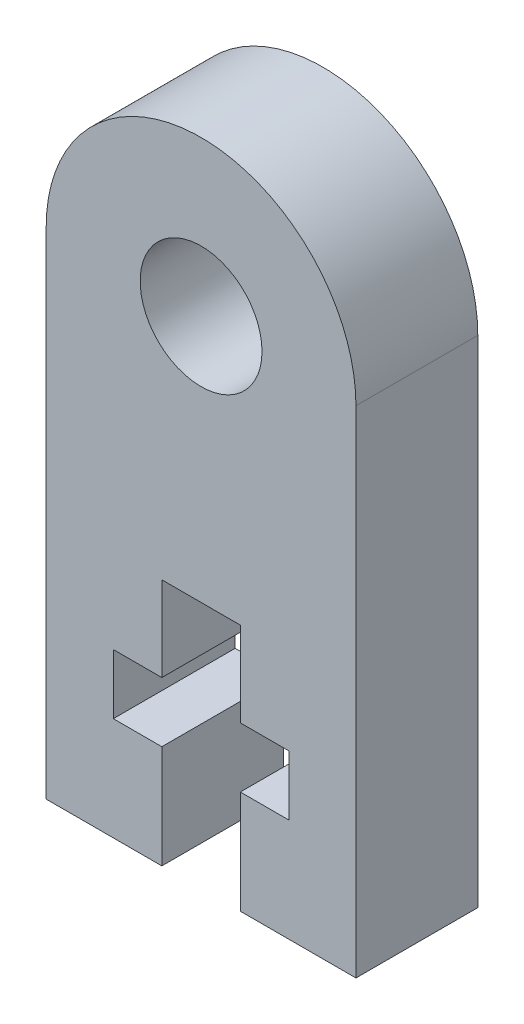
ISO-10303-21;
HEADER;
FILE_DESCRIPTION(('STEP AP214'),'2;1');
FILE_NAME('part.step','',(''),(''),'','','');
FILE_SCHEMA(('AUTOMOTIVE_DESIGN { 1 0 10303 214 1 1 1 1 }'));
ENDSEC;
DATA;
#1=APPLICATION_CONTEXT('core data for automotive mechanical design processes');
#2=APPLICATION_PROTOCOL_DEFINITION('international standard','automotive_design',2000,#1);
#3=PRODUCT_CONTEXT('',#1,'mechanical');
#4=PRODUCT('Part','Part','',(#3));
#5=PRODUCT_RELATED_PRODUCT_CATEGORY('part','',(#4));
#6=PRODUCT_DEFINITION_FORMATION('','',#4);
#7=PRODUCT_DEFINITION_CONTEXT('part definition',#1,'design');
#8=PRODUCT_DEFINITION('design','',#6,#7);
#9=PRODUCT_DEFINITION_SHAPE('','',#8);
#10=(LENGTH_UNIT() NAMED_UNIT(*) SI_UNIT(.MILLI.,.METRE.));
#11=(NAMED_UNIT(*) PLANE_ANGLE_UNIT() SI_UNIT($,.RADIAN.));
#12=(NAMED_UNIT(*) SI_UNIT($,.STERADIAN.) SOLID_ANGLE_UNIT());
#13=UNCERTAINTY_MEASURE_WITH_UNIT(LENGTH_MEASURE(1.E-05),#10,'distance_accuracy_value','');
#14=(GEOMETRIC_REPRESENTATION_CONTEXT(3) GLOBAL_UNCERTAINTY_ASSIGNED_CONTEXT((#13)) GLOBAL_UNIT_ASSIGNED_CONTEXT((#10,
#11,#12)) REPRESENTATION_CONTEXT('',''));
#15=CARTESIAN_POINT('',(0.,0.,0.));
#16=DIRECTION('',(0.,0.,1.));
#17=DIRECTION('',(1.,0.,0.));
#18=AXIS2_PLACEMENT_3D('',#15,#16,#17);
#19=CARTESIAN_POINT('',(-7.5,-24.,5.9));
#20=DIRECTION('',(0.,1.,0.));
#21=DIRECTION('',(-1.,0.,0.));
#22=AXIS2_PLACEMENT_3D('',#19,#20,#21);
#23=PLANE('',#22);
#24=DIRECTION('',(1.,0.,0.));
#25=VECTOR('',#24,1.);
#26=CARTESIAN_POINT('',(-7.5,-24.,0.));
#27=LINE('',#26,#25);
#28=CARTESIAN_POINT('',(-7.5,-24.,0.));
#29=VERTEX_POINT('',#28);
#30=CARTESIAN_POINT('',(-1.9,-24.,0.));
#31=VERTEX_POINT('',#30);
#32=EDGE_CURVE('E185',#29,#31,#27,.T.);
#33=ORIENTED_EDGE('',*,*,#32,.T.);
#34=DIRECTION('',(0.,0.,1.));
#35=VECTOR('',#34,1.);
#36=CARTESIAN_POINT('',(-1.9,-24.,0.));
#37=LINE('',#36,#35);
#38=CARTESIAN_POINT('',(-1.9,-24.,5.9));
#39=VERTEX_POINT('',#38);
#40=EDGE_CURVE('E168',#31,#39,#37,.T.);
#41=ORIENTED_EDGE('',*,*,#40,.T.);
#42=DIRECTION('',(1.,0.,0.));
#43=VECTOR('',#42,1.);
#44=CARTESIAN_POINT('',(-7.5,-24.,5.9));
#45=LINE('',#44,#43);
#46=CARTESIAN_POINT('',(-7.5,-24.,5.9));
#47=VERTEX_POINT('',#46);
#48=EDGE_CURVE('E232',#47,#39,#45,.T.);
#49=ORIENTED_EDGE('',*,*,#48,.F.);
#50=DIRECTION('',(0.,0.,-1.));
#51=VECTOR('',#50,1.);
#52=CARTESIAN_POINT('',(-7.5,-24.,5.9));
#53=LINE('',#52,#51);
#54=EDGE_CURVE('E190',#47,#29,#53,.T.);
#55=ORIENTED_EDGE('',*,*,#54,.T.);
#56=EDGE_LOOP('',(#33,#41,#49,#55));
#57=FACE_BOUND('',#56,.T.);
#58=ADVANCED_FACE('F45',(#57),#23,.F.);
#59=CARTESIAN_POINT('',(0.,0.,5.9));
#60=DIRECTION('',(0.,0.,-1.));
#61=DIRECTION('',(-1.,0.,0.));
#62=AXIS2_PLACEMENT_3D('',#59,#60,#61);
#63=PLANE('',#62);
#64=ORIENTED_EDGE('',*,*,#48,.T.);
#65=DIRECTION('',(0.,-1.,0.));
#66=VECTOR('',#65,1.);
#67=CARTESIAN_POINT('',(-1.9,-24.,5.9));
#68=LINE('',#67,#66);
#69=CARTESIAN_POINT('',(-1.9,-19.,5.9));
#70=VERTEX_POINT('',#69);
#71=EDGE_CURVE('E174',#70,#39,#68,.T.);
#72=ORIENTED_EDGE('',*,*,#71,.F.);
#73=DIRECTION('',(1.,0.,0.));
#74=VECTOR('',#73,1.);
#75=CARTESIAN_POINT('',(-4.25,-19.,5.9));
#76=LINE('',#75,#74);
#77=CARTESIAN_POINT('',(-4.25,-19.,5.9));
#78=VERTEX_POINT('',#77);
#79=EDGE_CURVE('E188',#78,#70,#76,.T.);
#80=ORIENTED_EDGE('',*,*,#79,.F.);
#81=DIRECTION('',(0.,-1.,0.));
#82=VECTOR('',#81,1.);
#83=CARTESIAN_POINT('',(-4.25,-16.1,5.9));
#84=LINE('',#83,#82);
#85=CARTESIAN_POINT('',(-4.25,-16.1,5.9));
#86=VERTEX_POINT('',#85);
#87=EDGE_CURVE('E267',#86,#78,#84,.T.);
#88=ORIENTED_EDGE('',*,*,#87,.F.);
#89=DIRECTION('',(-1.,0.,0.));
#90=VECTOR('',#89,1.);
#91=CARTESIAN_POINT('',(-4.25,-16.1,5.9));
#92=LINE('',#91,#90);
#93=CARTESIAN_POINT('',(-1.9,-16.1,5.9));
#94=VERTEX_POINT('',#93);
#95=EDGE_CURVE('E264',#94,#86,#92,.T.);
#96=ORIENTED_EDGE('',*,*,#95,.F.);
#97=DIRECTION('',(0.,-1.,0.));
#98=VECTOR('',#97,1.);
#99=CARTESIAN_POINT('',(-1.9,-16.1,5.9));
#100=LINE('',#99,#98);
#101=CARTESIAN_POINT('',(-1.9,-12.,5.9));
#102=VERTEX_POINT('',#101);
#103=EDGE_CURVE('E261',#102,#94,#100,.T.);
#104=ORIENTED_EDGE('',*,*,#103,.F.);
#105=DIRECTION('',(-1.,0.,0.));
#106=VECTOR('',#105,1.);
#107=CARTESIAN_POINT('',(-1.9,-12.,5.9));
#108=LINE('',#107,#106);
#109=CARTESIAN_POINT('',(1.9,-12.,5.9));
#110=VERTEX_POINT('',#109);
#111=EDGE_CURVE('E258',#110,#102,#108,.T.);
#112=ORIENTED_EDGE('',*,*,#111,.F.);
#113=DIRECTION('',(0.,1.,0.));
#114=VECTOR('',#113,1.);
#115=CARTESIAN_POINT('',(1.9,-16.1,5.9));
#116=LINE('',#115,#114);
#117=CARTESIAN_POINT('',(1.9,-16.1,5.9));
#118=VERTEX_POINT('',#117);
#119=EDGE_CURVE('E255',#118,#110,#116,.T.);
#120=ORIENTED_EDGE('',*,*,#119,.F.);
#121=DIRECTION('',(-1.,0.,0.));
#122=VECTOR('',#121,1.);
#123=CARTESIAN_POINT('',(1.9,-16.1,5.9));
#124=LINE('',#123,#122);
#125=CARTESIAN_POINT('',(4.25,-16.1,5.9));
#126=VERTEX_POINT('',#125);
#127=EDGE_CURVE('E252',#126,#118,#124,.T.);
#128=ORIENTED_EDGE('',*,*,#127,.F.);
#129=DIRECTION('',(0.,1.,0.));
#130=VECTOR('',#129,1.);
#131=CARTESIAN_POINT('',(4.25,-16.1,5.9));
#132=LINE('',#131,#130);
#133=CARTESIAN_POINT('',(4.25,-19.,5.9));
#134=VERTEX_POINT('',#133);
#135=EDGE_CURVE('E249',#134,#126,#132,.T.);
#136=ORIENTED_EDGE('',*,*,#135,.F.);
#137=DIRECTION('',(1.,0.,0.));
#138=VECTOR('',#137,1.);
#139=CARTESIAN_POINT('',(1.9,-19.,5.9));
#140=LINE('',#139,#138);
#141=CARTESIAN_POINT('',(1.9,-19.,5.9));
#142=VERTEX_POINT('',#141);
#143=EDGE_CURVE('E242',#142,#134,#140,.T.);
#144=ORIENTED_EDGE('',*,*,#143,.F.);
#145=DIRECTION('',(0.,1.,0.));
#146=VECTOR('',#145,1.);
#147=CARTESIAN_POINT('',(1.9,-24.,5.9));
#148=LINE('',#147,#146);
#149=CARTESIAN_POINT('',(1.9,-24.,5.9));
#150=VERTEX_POINT('',#149);
#151=EDGE_CURVE('E240',#150,#142,#148,.T.);
#152=ORIENTED_EDGE('',*,*,#151,.F.);
#153=CARTESIAN_POINT('',(7.5,-24.,5.9));
#154=VERTEX_POINT('',#153);
#155=EDGE_CURVE('E97',#150,#154,#45,.T.);
#156=ORIENTED_EDGE('',*,*,#155,.T.);
#157=DIRECTION('',(0.,1.,0.));
#158=VECTOR('',#157,1.);
#159=CARTESIAN_POINT('',(7.5,-24.,5.9));
#160=LINE('',#159,#158);
#161=CARTESIAN_POINT('',(7.5,0.,5.9));
#162=VERTEX_POINT('',#161);
#163=EDGE_CURVE('E217',#154,#162,#160,.T.);
#164=ORIENTED_EDGE('',*,*,#163,.T.);
#165=CARTESIAN_POINT('',(0.,0.,5.9));
#166=DIRECTION('',(0.,0.,1.));
#167=DIRECTION('',(-1.,0.,0.));
#168=AXIS2_PLACEMENT_3D('',#165,#166,#167);
#169=CIRCLE('',#168,7.5);
#170=CARTESIAN_POINT('',(-7.5,0.,5.9));
#171=VERTEX_POINT('',#170);
#172=EDGE_CURVE('E211',#162,#171,#169,.T.);
#173=ORIENTED_EDGE('',*,*,#172,.T.);
#174=DIRECTION('',(0.,-1.,0.));
#175=VECTOR('',#174,1.);
#176=CARTESIAN_POINT('',(-7.5,0.,5.9));
#177=LINE('',#176,#175);
#178=EDGE_CURVE('E69',#171,#47,#177,.T.);
#179=ORIENTED_EDGE('',*,*,#178,.T.);
#180=EDGE_LOOP('',(#64,#72,#80,#88,#96,#104,#112,#120,#128,#136,#144,#152,#156,#164,#173,#179));
#181=FACE_BOUND('',#180,.T.);
#182=CARTESIAN_POINT('',(0.,0.,5.9));
#183=DIRECTION('',(0.,0.,1.));
#184=DIRECTION('',(1.,0.,0.));
#185=AXIS2_PLACEMENT_3D('',#182,#183,#184);
#186=CIRCLE('',#185,2.95);
#187=CARTESIAN_POINT('',(2.95,0.,5.9));
#188=VERTEX_POINT('',#187);
#189=EDGE_CURVE('E196',#188,#188,#186,.T.);
#190=ORIENTED_EDGE('',*,*,#189,.F.);
#191=EDGE_LOOP('',(#190));
#192=FACE_BOUND('',#191,.T.);
#193=ADVANCED_FACE('F234',(#181,#192),#63,.F.);
#194=CARTESIAN_POINT('',(0.,0.,0.));
#195=DIRECTION('',(0.,0.,-1.));
#196=DIRECTION('',(-1.,0.,0.));
#197=AXIS2_PLACEMENT_3D('',#194,#195,#196);
#198=PLANE('',#197);
#199=DIRECTION('',(0.,-1.,0.));
#200=VECTOR('',#199,1.);
#201=CARTESIAN_POINT('',(-1.9,-24.,0.));
#202=LINE('',#201,#200);
#203=CARTESIAN_POINT('',(-1.9,-19.,0.));
#204=VERTEX_POINT('',#203);
#205=EDGE_CURVE('E171',#204,#31,#202,.T.);
#206=ORIENTED_EDGE('',*,*,#205,.T.);
#207=ORIENTED_EDGE('',*,*,#32,.F.);
#208=DIRECTION('',(0.,-1.,0.));
#209=VECTOR('',#208,1.);
#210=CARTESIAN_POINT('',(-7.5,0.,0.));
#211=LINE('',#210,#209);
#212=CARTESIAN_POINT('',(-7.5,0.,0.));
#213=VERTEX_POINT('',#212);
#214=EDGE_CURVE('E90',#213,#29,#211,.T.);
#215=ORIENTED_EDGE('',*,*,#214,.F.);
#216=CARTESIAN_POINT('',(0.,0.,0.));
#217=DIRECTION('',(0.,0.,1.));
#218=DIRECTION('',(-1.,0.,0.));
#219=AXIS2_PLACEMENT_3D('',#216,#217,#218);
#220=CIRCLE('',#219,7.5);
#221=CARTESIAN_POINT('',(7.5,0.,0.));
#222=VERTEX_POINT('',#221);
#223=EDGE_CURVE('E194',#222,#213,#220,.T.);
#224=ORIENTED_EDGE('',*,*,#223,.F.);
#225=DIRECTION('',(0.,1.,0.));
#226=VECTOR('',#225,1.);
#227=CARTESIAN_POINT('',(7.5,-24.,0.));
#228=LINE('',#227,#226);
#229=CARTESIAN_POINT('',(7.5,-24.,0.));
#230=VERTEX_POINT('',#229);
#231=EDGE_CURVE('E191',#230,#222,#228,.T.);
#232=ORIENTED_EDGE('',*,*,#231,.F.);
#233=CARTESIAN_POINT('',(1.9,-24.,0.));
#234=VERTEX_POINT('',#233);
#235=EDGE_CURVE('E192',#234,#230,#27,.T.);
#236=ORIENTED_EDGE('',*,*,#235,.F.);
#237=DIRECTION('',(0.,1.,0.));
#238=VECTOR('',#237,1.);
#239=CARTESIAN_POINT('',(1.9,-24.,0.));
#240=LINE('',#239,#238);
#241=CARTESIAN_POINT('',(1.9,-19.,0.));
#242=VERTEX_POINT('',#241);
#243=EDGE_CURVE('E60',#234,#242,#240,.T.);
#244=ORIENTED_EDGE('',*,*,#243,.T.);
#245=DIRECTION('',(1.,0.,0.));
#246=VECTOR('',#245,1.);
#247=CARTESIAN_POINT('',(1.9,-19.,0.));
#248=LINE('',#247,#246);
#249=CARTESIAN_POINT('',(4.25,-19.,0.));
#250=VERTEX_POINT('',#249);
#251=EDGE_CURVE('E308',#242,#250,#248,.T.);
#252=ORIENTED_EDGE('',*,*,#251,.T.);
#253=DIRECTION('',(0.,1.,0.));
#254=VECTOR('',#253,1.);
#255=CARTESIAN_POINT('',(4.25,-16.1,0.));
#256=LINE('',#255,#254);
#257=CARTESIAN_POINT('',(4.25,-16.1,0.));
#258=VERTEX_POINT('',#257);
#259=EDGE_CURVE('E291',#250,#258,#256,.T.);
#260=ORIENTED_EDGE('',*,*,#259,.T.);
#261=DIRECTION('',(-1.,0.,0.));
#262=VECTOR('',#261,1.);
#263=CARTESIAN_POINT('',(1.9,-16.1,0.));
#264=LINE('',#263,#262);
#265=CARTESIAN_POINT('',(1.9,-16.1,0.));
#266=VERTEX_POINT('',#265);
#267=EDGE_CURVE('E304',#258,#266,#264,.T.);
#268=ORIENTED_EDGE('',*,*,#267,.T.);
#269=DIRECTION('',(0.,1.,0.));
#270=VECTOR('',#269,1.);
#271=CARTESIAN_POINT('',(1.9,-16.1,0.));
#272=LINE('',#271,#270);
#273=CARTESIAN_POINT('',(1.9,-12.,0.));
#274=VERTEX_POINT('',#273);
#275=EDGE_CURVE('E306',#266,#274,#272,.T.);
#276=ORIENTED_EDGE('',*,*,#275,.T.);
#277=DIRECTION('',(-1.,0.,0.));
#278=VECTOR('',#277,1.);
#279=CARTESIAN_POINT('',(-1.9,-12.,0.));
#280=LINE('',#279,#278);
#281=CARTESIAN_POINT('',(-1.9,-12.,0.));
#282=VERTEX_POINT('',#281);
#283=EDGE_CURVE('E314',#274,#282,#280,.T.);
#284=ORIENTED_EDGE('',*,*,#283,.T.);
#285=DIRECTION('',(0.,-1.,0.));
#286=VECTOR('',#285,1.);
#287=CARTESIAN_POINT('',(-1.9,-16.1,0.));
#288=LINE('',#287,#286);
#289=CARTESIAN_POINT('',(-1.9,-16.1,0.));
#290=VERTEX_POINT('',#289);
#291=EDGE_CURVE('E317',#282,#290,#288,.T.);
#292=ORIENTED_EDGE('',*,*,#291,.T.);
#293=DIRECTION('',(-1.,0.,0.));
#294=VECTOR('',#293,1.);
#295=CARTESIAN_POINT('',(-4.25,-16.1,0.));
#296=LINE('',#295,#294);
#297=CARTESIAN_POINT('',(-4.25,-16.1,0.));
#298=VERTEX_POINT('',#297);
#299=EDGE_CURVE('E320',#290,#298,#296,.T.);
#300=ORIENTED_EDGE('',*,*,#299,.T.);
#301=DIRECTION('',(0.,-1.,0.));
#302=VECTOR('',#301,1.);
#303=CARTESIAN_POINT('',(-4.25,-16.1,0.));
#304=LINE('',#303,#302);
#305=CARTESIAN_POINT('',(-4.25,-19.,0.));
#306=VERTEX_POINT('',#305);
#307=EDGE_CURVE('E322',#298,#306,#304,.T.);
#308=ORIENTED_EDGE('',*,*,#307,.T.);
#309=DIRECTION('',(1.,0.,0.));
#310=VECTOR('',#309,1.);
#311=CARTESIAN_POINT('',(-4.25,-19.,0.));
#312=LINE('',#311,#310);
#313=EDGE_CURVE('E179',#306,#204,#312,.T.);
#314=ORIENTED_EDGE('',*,*,#313,.T.);
#315=EDGE_LOOP('',(#206,#207,#215,#224,#232,#236,#244,#252,#260,#268,#276,#284,#292,#300,#308,#314));
#316=FACE_BOUND('',#315,.T.);
#317=CARTESIAN_POINT('',(0.,0.,0.));
#318=DIRECTION('',(0.,0.,1.));
#319=DIRECTION('',(1.,0.,0.));
#320=AXIS2_PLACEMENT_3D('',#317,#318,#319);
#321=CIRCLE('',#320,2.95);
#322=CARTESIAN_POINT('',(2.95,0.,0.));
#323=VERTEX_POINT('',#322);
#324=EDGE_CURVE('E228',#323,#323,#321,.T.);
#325=ORIENTED_EDGE('',*,*,#324,.T.);
#326=EDGE_LOOP('',(#325));
#327=FACE_BOUND('',#326,.T.);
#328=ADVANCED_FACE('F183',(#316,#327),#198,.T.);
#329=ORIENTED_EDGE('',*,*,#155,.F.);
#330=DIRECTION('',(0.,0.,1.));
#331=VECTOR('',#330,1.);
#332=CARTESIAN_POINT('',(1.9,-24.,0.));
#333=LINE('',#332,#331);
#334=EDGE_CURVE('E178',#234,#150,#333,.T.);
#335=ORIENTED_EDGE('',*,*,#334,.F.);
#336=ORIENTED_EDGE('',*,*,#235,.T.);
#337=DIRECTION('',(0.,0.,-1.));
#338=VECTOR('',#337,1.);
#339=CARTESIAN_POINT('',(7.5,-24.,5.9));
#340=LINE('',#339,#338);
#341=EDGE_CURVE('E13',#154,#230,#340,.T.);
#342=ORIENTED_EDGE('',*,*,#341,.F.);
#343=EDGE_LOOP('',(#329,#335,#336,#342));
#344=FACE_BOUND('',#343,.T.);
#345=ADVANCED_FACE('F47',(#344),#23,.F.);
#346=CARTESIAN_POINT('',(7.5,-24.,5.9));
#347=DIRECTION('',(-1.,0.,0.));
#348=DIRECTION('',(0.,-1.,0.));
#349=AXIS2_PLACEMENT_3D('',#346,#347,#348);
#350=PLANE('',#349);
#351=ORIENTED_EDGE('',*,*,#231,.T.);
#352=DIRECTION('',(0.,0.,-1.));
#353=VECTOR('',#352,1.);
#354=CARTESIAN_POINT('',(7.5,0.,5.9));
#355=LINE('',#354,#353);
#356=EDGE_CURVE('E53',#162,#222,#355,.T.);
#357=ORIENTED_EDGE('',*,*,#356,.F.);
#358=ORIENTED_EDGE('',*,*,#163,.F.);
#359=ORIENTED_EDGE('',*,*,#341,.T.);
#360=EDGE_LOOP('',(#351,#357,#358,#359));
#361=FACE_BOUND('',#360,.T.);
#362=ADVANCED_FACE('F216',(#361),#350,.F.);
#363=CARTESIAN_POINT('',(0.,0.,5.9));
#364=DIRECTION('',(0.,0.,-1.));
#365=DIRECTION('',(-1.,0.,0.));
#366=AXIS2_PLACEMENT_3D('',#363,#364,#365);
#367=CYLINDRICAL_SURFACE('',#366,7.5);
#368=ORIENTED_EDGE('',*,*,#223,.T.);
#369=DIRECTION('',(0.,0.,-1.));
#370=VECTOR('',#369,1.);
#371=CARTESIAN_POINT('',(-7.5,0.,5.9));
#372=LINE('',#371,#370);
#373=EDGE_CURVE('E203',#171,#213,#372,.T.);
#374=ORIENTED_EDGE('',*,*,#373,.F.);
#375=ORIENTED_EDGE('',*,*,#172,.F.);
#376=ORIENTED_EDGE('',*,*,#356,.T.);
#377=EDGE_LOOP('',(#368,#374,#375,#376));
#378=FACE_BOUND('',#377,.T.);
#379=ADVANCED_FACE('F209',(#378),#367,.T.);
#380=CARTESIAN_POINT('',(-7.5,0.,5.9));
#381=DIRECTION('',(1.,0.,0.));
#382=DIRECTION('',(0.,1.,0.));
#383=AXIS2_PLACEMENT_3D('',#380,#381,#382);
#384=PLANE('',#383);
#385=ORIENTED_EDGE('',*,*,#214,.T.);
#386=ORIENTED_EDGE('',*,*,#54,.F.);
#387=ORIENTED_EDGE('',*,*,#178,.F.);
#388=ORIENTED_EDGE('',*,*,#373,.T.);
#389=EDGE_LOOP('',(#385,#386,#387,#388));
#390=FACE_BOUND('',#389,.T.);
#391=ADVANCED_FACE('F236',(#390),#384,.F.);
#392=CARTESIAN_POINT('',(0.,0.,5.9));
#393=DIRECTION('',(0.,0.,-1.));
#394=DIRECTION('',(-1.,0.,0.));
#395=AXIS2_PLACEMENT_3D('',#392,#393,#394);
#396=CYLINDRICAL_SURFACE('',#395,2.95);
#397=ORIENTED_EDGE('',*,*,#189,.T.);
#398=EDGE_LOOP('',(#397));
#399=FACE_BOUND('',#398,.T.);
#400=ORIENTED_EDGE('',*,*,#324,.F.);
#401=EDGE_LOOP('',(#400));
#402=FACE_BOUND('',#401,.T.);
#403=ADVANCED_FACE('F337',(#399,#402),#396,.F.);
#404=CARTESIAN_POINT('',(-1.9,-24.,0.));
#405=DIRECTION('',(-1.,0.,0.));
#406=DIRECTION('',(0.,0.,1.));
#407=AXIS2_PLACEMENT_3D('',#404,#405,#406);
#408=PLANE('',#407);
#409=ORIENTED_EDGE('',*,*,#71,.T.);
#410=ORIENTED_EDGE('',*,*,#40,.F.);
#411=ORIENTED_EDGE('',*,*,#205,.F.);
#412=DIRECTION('',(0.,0.,1.));
#413=VECTOR('',#412,1.);
#414=CARTESIAN_POINT('',(-1.9,-19.,0.));
#415=LINE('',#414,#413);
#416=EDGE_CURVE('E231',#204,#70,#415,.T.);
#417=ORIENTED_EDGE('',*,*,#416,.T.);
#418=EDGE_LOOP('',(#409,#410,#411,#417));
#419=FACE_BOUND('',#418,.T.);
#420=ADVANCED_FACE('F170',(#419),#408,.F.);
#421=CARTESIAN_POINT('',(-4.25,-19.,0.));
#422=DIRECTION('',(0.,-1.,0.));
#423=DIRECTION('',(0.,0.,-1.));
#424=AXIS2_PLACEMENT_3D('',#421,#422,#423);
#425=PLANE('',#424);
#426=ORIENTED_EDGE('',*,*,#79,.T.);
#427=ORIENTED_EDGE('',*,*,#416,.F.);
#428=ORIENTED_EDGE('',*,*,#313,.F.);
#429=DIRECTION('',(0.,0.,1.));
#430=VECTOR('',#429,1.);
#431=CARTESIAN_POINT('',(-4.25,-19.,0.));
#432=LINE('',#431,#430);
#433=EDGE_CURVE('E272',#306,#78,#432,.T.);
#434=ORIENTED_EDGE('',*,*,#433,.T.);
#435=EDGE_LOOP('',(#426,#427,#428,#434));
#436=FACE_BOUND('',#435,.T.);
#437=ADVANCED_FACE('F328',(#436),#425,.F.);
#438=CARTESIAN_POINT('',(-4.25,-16.1,0.));
#439=DIRECTION('',(-1.,0.,0.));
#440=DIRECTION('',(0.,0.,1.));
#441=AXIS2_PLACEMENT_3D('',#438,#439,#440);
#442=PLANE('',#441);
#443=ORIENTED_EDGE('',*,*,#87,.T.);
#444=ORIENTED_EDGE('',*,*,#433,.F.);
#445=ORIENTED_EDGE('',*,*,#307,.F.);
#446=DIRECTION('',(0.,0.,1.));
#447=VECTOR('',#446,1.);
#448=CARTESIAN_POINT('',(-4.25,-16.1,0.));
#449=LINE('',#448,#447);
#450=EDGE_CURVE('E274',#298,#86,#449,.T.);
#451=ORIENTED_EDGE('',*,*,#450,.T.);
#452=EDGE_LOOP('',(#443,#444,#445,#451));
#453=FACE_BOUND('',#452,.T.);
#454=ADVANCED_FACE('F326',(#453),#442,.F.);
#455=CARTESIAN_POINT('',(-4.25,-16.1,0.));
#456=DIRECTION('',(0.,1.,0.));
#457=DIRECTION('',(0.,0.,1.));
#458=AXIS2_PLACEMENT_3D('',#455,#456,#457);
#459=PLANE('',#458);
#460=ORIENTED_EDGE('',*,*,#95,.T.);
#461=ORIENTED_EDGE('',*,*,#450,.F.);
#462=ORIENTED_EDGE('',*,*,#299,.F.);
#463=DIRECTION('',(0.,0.,1.));
#464=VECTOR('',#463,1.);
#465=CARTESIAN_POINT('',(-1.9,-16.1,0.));
#466=LINE('',#465,#464);
#467=EDGE_CURVE('E276',#290,#94,#466,.T.);
#468=ORIENTED_EDGE('',*,*,#467,.T.);
#469=EDGE_LOOP('',(#460,#461,#462,#468));
#470=FACE_BOUND('',#469,.T.);
#471=ADVANCED_FACE('F335',(#470),#459,.F.);
#472=CARTESIAN_POINT('',(-1.9,-16.1,0.));
#473=DIRECTION('',(-1.,0.,0.));
#474=DIRECTION('',(0.,-1.,0.));
#475=AXIS2_PLACEMENT_3D('',#472,#473,#474);
#476=PLANE('',#475);
#477=ORIENTED_EDGE('',*,*,#103,.T.);
#478=ORIENTED_EDGE('',*,*,#467,.F.);
#479=ORIENTED_EDGE('',*,*,#291,.F.);
#480=DIRECTION('',(0.,0.,1.));
#481=VECTOR('',#480,1.);
#482=CARTESIAN_POINT('',(-1.9,-12.,0.));
#483=LINE('',#482,#481);
#484=EDGE_CURVE('E278',#282,#102,#483,.T.);
#485=ORIENTED_EDGE('',*,*,#484,.T.);
#486=EDGE_LOOP('',(#477,#478,#479,#485));
#487=FACE_BOUND('',#486,.T.);
#488=ADVANCED_FACE('F397',(#487),#476,.F.);
#489=CARTESIAN_POINT('',(-1.9,-12.,0.));
#490=DIRECTION('',(0.,1.,0.));
#491=DIRECTION('',(0.,0.,1.));
#492=AXIS2_PLACEMENT_3D('',#489,#490,#491);
#493=PLANE('',#492);
#494=ORIENTED_EDGE('',*,*,#111,.T.);
#495=ORIENTED_EDGE('',*,*,#484,.F.);
#496=ORIENTED_EDGE('',*,*,#283,.F.);
#497=DIRECTION('',(0.,0.,1.));
#498=VECTOR('',#497,1.);
#499=CARTESIAN_POINT('',(1.9,-12.,0.));
#500=LINE('',#499,#498);
#501=EDGE_CURVE('E280',#274,#110,#500,.T.);
#502=ORIENTED_EDGE('',*,*,#501,.T.);
#503=EDGE_LOOP('',(#494,#495,#496,#502));
#504=FACE_BOUND('',#503,.T.);
#505=ADVANCED_FACE('F407',(#504),#493,.F.);
#506=CARTESIAN_POINT('',(1.9,-16.1,0.));
#507=DIRECTION('',(1.,0.,0.));
#508=DIRECTION('',(0.,1.,0.));
#509=AXIS2_PLACEMENT_3D('',#506,#507,#508);
#510=PLANE('',#509);
#511=ORIENTED_EDGE('',*,*,#119,.T.);
#512=ORIENTED_EDGE('',*,*,#501,.F.);
#513=ORIENTED_EDGE('',*,*,#275,.F.);
#514=DIRECTION('',(0.,0.,1.));
#515=VECTOR('',#514,1.);
#516=CARTESIAN_POINT('',(1.9,-16.1,0.));
#517=LINE('',#516,#515);
#518=EDGE_CURVE('E282',#266,#118,#517,.T.);
#519=ORIENTED_EDGE('',*,*,#518,.T.);
#520=EDGE_LOOP('',(#511,#512,#513,#519));
#521=FACE_BOUND('',#520,.T.);
#522=ADVANCED_FACE('F417',(#521),#510,.F.);
#523=CARTESIAN_POINT('',(1.9,-16.1,0.));
#524=DIRECTION('',(0.,1.,0.));
#525=DIRECTION('',(0.,0.,1.));
#526=AXIS2_PLACEMENT_3D('',#523,#524,#525);
#527=PLANE('',#526);
#528=ORIENTED_EDGE('',*,*,#127,.T.);
#529=ORIENTED_EDGE('',*,*,#518,.F.);
#530=ORIENTED_EDGE('',*,*,#267,.F.);
#531=DIRECTION('',(0.,0.,1.));
#532=VECTOR('',#531,1.);
#533=CARTESIAN_POINT('',(4.25,-16.1,0.));
#534=LINE('',#533,#532);
#535=EDGE_CURVE('E284',#258,#126,#534,.T.);
#536=ORIENTED_EDGE('',*,*,#535,.T.);
#537=EDGE_LOOP('',(#528,#529,#530,#536));
#538=FACE_BOUND('',#537,.T.);
#539=ADVANCED_FACE('F300',(#538),#527,.F.);
#540=CARTESIAN_POINT('',(4.25,-16.1,0.));
#541=DIRECTION('',(1.,0.,0.));
#542=DIRECTION('',(0.,0.,-1.));
#543=AXIS2_PLACEMENT_3D('',#540,#541,#542);
#544=PLANE('',#543);
#545=ORIENTED_EDGE('',*,*,#135,.T.);
#546=ORIENTED_EDGE('',*,*,#535,.F.);
#547=ORIENTED_EDGE('',*,*,#259,.F.);
#548=DIRECTION('',(0.,0.,1.));
#549=VECTOR('',#548,1.);
#550=CARTESIAN_POINT('',(4.25,-19.,0.));
#551=LINE('',#550,#549);
#552=EDGE_CURVE('E222',#250,#134,#551,.T.);
#553=ORIENTED_EDGE('',*,*,#552,.T.);
#554=EDGE_LOOP('',(#545,#546,#547,#553));
#555=FACE_BOUND('',#554,.T.);
#556=ADVANCED_FACE('F287',(#555),#544,.F.);
#557=CARTESIAN_POINT('',(1.9,-19.,0.));
#558=DIRECTION('',(0.,-1.,0.));
#559=DIRECTION('',(0.,0.,-1.));
#560=AXIS2_PLACEMENT_3D('',#557,#558,#559);
#561=PLANE('',#560);
#562=ORIENTED_EDGE('',*,*,#143,.T.);
#563=ORIENTED_EDGE('',*,*,#552,.F.);
#564=ORIENTED_EDGE('',*,*,#251,.F.);
#565=DIRECTION('',(0.,0.,1.));
#566=VECTOR('',#565,1.);
#567=CARTESIAN_POINT('',(1.9,-19.,0.));
#568=LINE('',#567,#566);
#569=EDGE_CURVE('E220',#242,#142,#568,.T.);
#570=ORIENTED_EDGE('',*,*,#569,.T.);
#571=EDGE_LOOP('',(#562,#563,#564,#570));
#572=FACE_BOUND('',#571,.T.);
#573=ADVANCED_FACE('F296',(#572),#561,.F.);
#574=CARTESIAN_POINT('',(1.9,-24.,0.));
#575=DIRECTION('',(1.,0.,0.));
#576=DIRECTION('',(0.,0.,-1.));
#577=AXIS2_PLACEMENT_3D('',#574,#575,#576);
#578=PLANE('',#577);
#579=ORIENTED_EDGE('',*,*,#151,.T.);
#580=ORIENTED_EDGE('',*,*,#569,.F.);
#581=ORIENTED_EDGE('',*,*,#243,.F.);
#582=ORIENTED_EDGE('',*,*,#334,.T.);
#583=EDGE_LOOP('',(#579,#580,#581,#582));
#584=FACE_BOUND('',#583,.T.);
#585=ADVANCED_FACE('F452',(#584),#578,.F.);
#586=CLOSED_SHELL('',(#58,#193,#328,#345,#362,#379,#391,#403,#420,#437,#454,#471,#488,#505,#522,
#539,#556,#573,#585));
#587=MANIFOLD_SOLID_BREP('B2',#586);
#588=ADVANCED_BREP_SHAPE_REPRESENTATION('',(#18,#587),#14);
#589=SHAPE_DEFINITION_REPRESENTATION(#9,#588);
ENDSEC;
END-ISO-10303-21;
